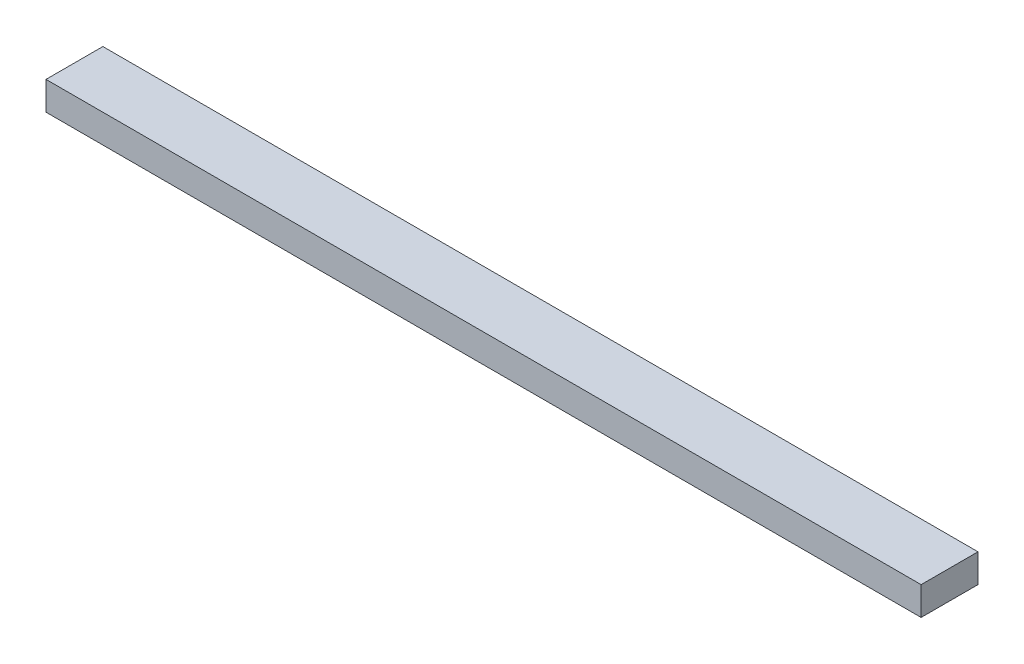
ISO-10303-21;
HEADER;
FILE_DESCRIPTION(('STEP AP214'),'2;1');
FILE_NAME('part.step','',(''),(''),'','','');
FILE_SCHEMA(('AUTOMOTIVE_DESIGN { 1 0 10303 214 1 1 1 1 }'));
ENDSEC;
DATA;
#1=APPLICATION_CONTEXT('core data for automotive mechanical design processes');
#2=APPLICATION_PROTOCOL_DEFINITION('international standard','automotive_design',2000,#1);
#3=PRODUCT_CONTEXT('',#1,'mechanical');
#4=PRODUCT('Part','Part','',(#3));
#5=PRODUCT_RELATED_PRODUCT_CATEGORY('part','',(#4));
#6=PRODUCT_DEFINITION_FORMATION('','',#4);
#7=PRODUCT_DEFINITION_CONTEXT('part definition',#1,'design');
#8=PRODUCT_DEFINITION('design','',#6,#7);
#9=PRODUCT_DEFINITION_SHAPE('','',#8);
#10=(LENGTH_UNIT() NAMED_UNIT(*) SI_UNIT(.MILLI.,.METRE.));
#11=(NAMED_UNIT(*) PLANE_ANGLE_UNIT() SI_UNIT($,.RADIAN.));
#12=(NAMED_UNIT(*) SI_UNIT($,.STERADIAN.) SOLID_ANGLE_UNIT());
#13=UNCERTAINTY_MEASURE_WITH_UNIT(LENGTH_MEASURE(1.E-05),#10,'distance_accuracy_value','');
#14=(GEOMETRIC_REPRESENTATION_CONTEXT(3) GLOBAL_UNCERTAINTY_ASSIGNED_CONTEXT((#13)) GLOBAL_UNIT_ASSIGNED_CONTEXT((#10,
#11,#12)) REPRESENTATION_CONTEXT('',''));
#15=CARTESIAN_POINT('',(0.,0.,0.));
#16=DIRECTION('',(0.,0.,1.));
#17=DIRECTION('',(1.,0.,0.));
#18=AXIS2_PLACEMENT_3D('',#15,#16,#17);
#19=CARTESIAN_POINT('',(0.,3.175,0.));
#20=DIRECTION('',(1.,0.,0.));
#21=DIRECTION('',(0.,0.,-1.));
#22=AXIS2_PLACEMENT_3D('',#19,#20,#21);
#23=PLANE('',#22);
#24=DIRECTION('',(0.,0.,1.));
#25=VECTOR('',#24,1.);
#26=CARTESIAN_POINT('',(0.,0.,0.));
#27=LINE('',#26,#25);
#28=CARTESIAN_POINT('',(0.,0.,-6.35));
#29=VERTEX_POINT('',#28);
#30=CARTESIAN_POINT('',(0.,0.,0.));
#31=VERTEX_POINT('',#30);
#32=EDGE_CURVE('E110',#29,#31,#27,.T.);
#33=ORIENTED_EDGE('',*,*,#32,.T.);
#34=DIRECTION('',(0.,-1.,0.));
#35=VECTOR('',#34,1.);
#36=CARTESIAN_POINT('',(0.,3.175,0.));
#37=LINE('',#36,#35);
#38=CARTESIAN_POINT('',(0.,3.175,0.));
#39=VERTEX_POINT('',#38);
#40=EDGE_CURVE('E11',#39,#31,#37,.T.);
#41=ORIENTED_EDGE('',*,*,#40,.F.);
#42=DIRECTION('',(0.,0.,1.));
#43=VECTOR('',#42,1.);
#44=CARTESIAN_POINT('',(0.,3.175,0.));
#45=LINE('',#44,#43);
#46=CARTESIAN_POINT('',(0.,3.175,-6.35));
#47=VERTEX_POINT('',#46);
#48=EDGE_CURVE('E94',#47,#39,#45,.T.);
#49=ORIENTED_EDGE('',*,*,#48,.F.);
#50=DIRECTION('',(0.,-1.,0.));
#51=VECTOR('',#50,1.);
#52=CARTESIAN_POINT('',(0.,3.175,-6.35));
#53=LINE('',#52,#51);
#54=EDGE_CURVE('E106',#47,#29,#53,.T.);
#55=ORIENTED_EDGE('',*,*,#54,.T.);
#56=EDGE_LOOP('',(#33,#41,#49,#55));
#57=FACE_BOUND('',#56,.T.);
#58=ADVANCED_FACE('F42',(#57),#23,.F.);
#59=CARTESIAN_POINT('',(0.,3.175,0.));
#60=DIRECTION('',(0.,0.,-1.));
#61=DIRECTION('',(-1.,0.,0.));
#62=AXIS2_PLACEMENT_3D('',#59,#60,#61);
#63=PLANE('',#62);
#64=DIRECTION('',(1.,0.,0.));
#65=VECTOR('',#64,1.);
#66=CARTESIAN_POINT('',(0.,0.,0.));
#67=LINE('',#66,#65);
#68=CARTESIAN_POINT('',(97.7,0.,0.));
#69=VERTEX_POINT('',#68);
#70=EDGE_CURVE('E99',#31,#69,#67,.T.);
#71=ORIENTED_EDGE('',*,*,#70,.T.);
#72=DIRECTION('',(0.,-1.,0.));
#73=VECTOR('',#72,1.);
#74=CARTESIAN_POINT('',(97.7,3.175,0.));
#75=LINE('',#74,#73);
#76=CARTESIAN_POINT('',(97.7,3.175,0.));
#77=VERTEX_POINT('',#76);
#78=EDGE_CURVE('E51',#77,#69,#75,.T.);
#79=ORIENTED_EDGE('',*,*,#78,.F.);
#80=DIRECTION('',(1.,0.,0.));
#81=VECTOR('',#80,1.);
#82=CARTESIAN_POINT('',(0.,3.175,0.));
#83=LINE('',#82,#81);
#84=EDGE_CURVE('E89',#39,#77,#83,.T.);
#85=ORIENTED_EDGE('',*,*,#84,.F.);
#86=ORIENTED_EDGE('',*,*,#40,.T.);
#87=EDGE_LOOP('',(#71,#79,#85,#86));
#88=FACE_BOUND('',#87,.T.);
#89=ADVANCED_FACE('F98',(#88),#63,.F.);
#90=CARTESIAN_POINT('',(97.7,3.175,0.));
#91=DIRECTION('',(-1.,0.,0.));
#92=DIRECTION('',(0.,0.,1.));
#93=AXIS2_PLACEMENT_3D('',#90,#91,#92);
#94=PLANE('',#93);
#95=DIRECTION('',(0.,0.,-1.));
#96=VECTOR('',#95,1.);
#97=CARTESIAN_POINT('',(97.7,0.,0.));
#98=LINE('',#97,#96);
#99=CARTESIAN_POINT('',(97.7,0.,-6.35));
#100=VERTEX_POINT('',#99);
#101=EDGE_CURVE('E76',#69,#100,#98,.T.);
#102=ORIENTED_EDGE('',*,*,#101,.T.);
#103=DIRECTION('',(0.,-1.,0.));
#104=VECTOR('',#103,1.);
#105=CARTESIAN_POINT('',(97.7,3.175,-6.35));
#106=LINE('',#105,#104);
#107=CARTESIAN_POINT('',(97.7,3.175,-6.35));
#108=VERTEX_POINT('',#107);
#109=EDGE_CURVE('E101',#108,#100,#106,.T.);
#110=ORIENTED_EDGE('',*,*,#109,.F.);
#111=DIRECTION('',(0.,0.,-1.));
#112=VECTOR('',#111,1.);
#113=CARTESIAN_POINT('',(97.7,3.175,0.));
#114=LINE('',#113,#112);
#115=EDGE_CURVE('E92',#77,#108,#114,.T.);
#116=ORIENTED_EDGE('',*,*,#115,.F.);
#117=ORIENTED_EDGE('',*,*,#78,.T.);
#118=EDGE_LOOP('',(#102,#110,#116,#117));
#119=FACE_BOUND('',#118,.T.);
#120=ADVANCED_FACE('F102',(#119),#94,.F.);
#121=CARTESIAN_POINT('',(0.,3.175,-6.35));
#122=DIRECTION('',(0.,0.,1.));
#123=DIRECTION('',(1.,0.,0.));
#124=AXIS2_PLACEMENT_3D('',#121,#122,#123);
#125=PLANE('',#124);
#126=DIRECTION('',(-1.,0.,0.));
#127=VECTOR('',#126,1.);
#128=CARTESIAN_POINT('',(0.,0.,-6.35));
#129=LINE('',#128,#127);
#130=EDGE_CURVE('E82',#100,#29,#129,.T.);
#131=ORIENTED_EDGE('',*,*,#130,.T.);
#132=ORIENTED_EDGE('',*,*,#54,.F.);
#133=DIRECTION('',(-1.,0.,0.));
#134=VECTOR('',#133,1.);
#135=CARTESIAN_POINT('',(0.,3.175,-6.35));
#136=LINE('',#135,#134);
#137=EDGE_CURVE('E59',#108,#47,#136,.T.);
#138=ORIENTED_EDGE('',*,*,#137,.F.);
#139=ORIENTED_EDGE('',*,*,#109,.T.);
#140=EDGE_LOOP('',(#131,#132,#138,#139));
#141=FACE_BOUND('',#140,.T.);
#142=ADVANCED_FACE('F123',(#141),#125,.F.);
#143=CARTESIAN_POINT('',(0.,3.175,0.));
#144=DIRECTION('',(0.,-1.,0.));
#145=DIRECTION('',(0.,0.,-1.));
#146=AXIS2_PLACEMENT_3D('',#143,#144,#145);
#147=PLANE('',#146);
#148=ORIENTED_EDGE('',*,*,#48,.T.);
#149=ORIENTED_EDGE('',*,*,#84,.T.);
#150=ORIENTED_EDGE('',*,*,#115,.T.);
#151=ORIENTED_EDGE('',*,*,#137,.T.);
#152=EDGE_LOOP('',(#148,#149,#150,#151));
#153=FACE_BOUND('',#152,.T.);
#154=ADVANCED_FACE('F90',(#153),#147,.F.);
#155=CARTESIAN_POINT('',(0.,0.,0.));
#156=DIRECTION('',(0.,-1.,0.));
#157=DIRECTION('',(0.,0.,-1.));
#158=AXIS2_PLACEMENT_3D('',#155,#156,#157);
#159=PLANE('',#158);
#160=ORIENTED_EDGE('',*,*,#32,.F.);
#161=ORIENTED_EDGE('',*,*,#130,.F.);
#162=ORIENTED_EDGE('',*,*,#101,.F.);
#163=ORIENTED_EDGE('',*,*,#70,.F.);
#164=EDGE_LOOP('',(#160,#161,#162,#163));
#165=FACE_BOUND('',#164,.T.);
#166=ADVANCED_FACE('F126',(#165),#159,.T.);
#167=CLOSED_SHELL('',(#58,#89,#120,#142,#154,#166));
#168=MANIFOLD_SOLID_BREP('B2',#167);
#169=ADVANCED_BREP_SHAPE_REPRESENTATION('',(#18,#168),#14);
#170=SHAPE_DEFINITION_REPRESENTATION(#9,#169);
ENDSEC;
END-ISO-10303-21;
